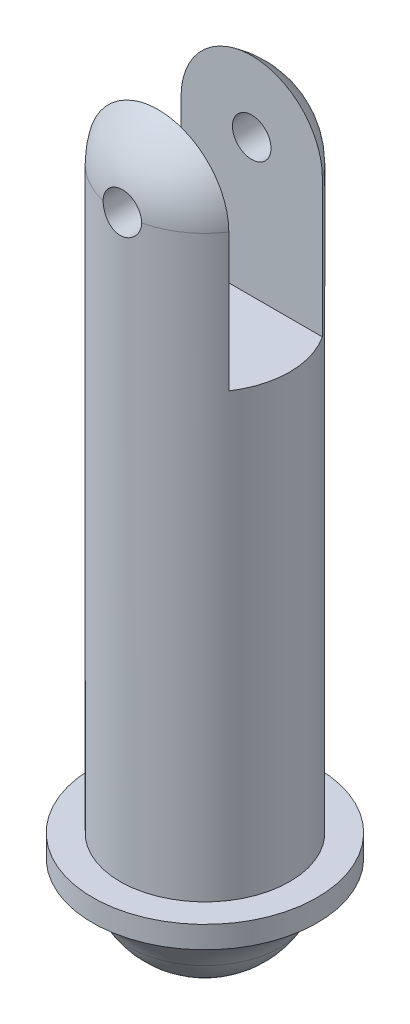
ISO-10303-21;
HEADER;
FILE_DESCRIPTION(('STEP AP214'),'2;1');
FILE_NAME('part.step','',(''),(''),'','','');
FILE_SCHEMA(('AUTOMOTIVE_DESIGN { 1 0 10303 214 1 1 1 1 }'));
ENDSEC;
DATA;
#1=APPLICATION_CONTEXT('core data for automotive mechanical design processes');
#2=APPLICATION_PROTOCOL_DEFINITION('international standard','automotive_design',2000,#1);
#3=PRODUCT_CONTEXT('',#1,'mechanical');
#4=PRODUCT('Part','Part','',(#3));
#5=PRODUCT_RELATED_PRODUCT_CATEGORY('part','',(#4));
#6=PRODUCT_DEFINITION_FORMATION('','',#4);
#7=PRODUCT_DEFINITION_CONTEXT('part definition',#1,'design');
#8=PRODUCT_DEFINITION('design','',#6,#7);
#9=PRODUCT_DEFINITION_SHAPE('','',#8);
#10=(LENGTH_UNIT() NAMED_UNIT(*) SI_UNIT(.MILLI.,.METRE.));
#11=(NAMED_UNIT(*) PLANE_ANGLE_UNIT() SI_UNIT($,.RADIAN.));
#12=(NAMED_UNIT(*) SI_UNIT($,.STERADIAN.) SOLID_ANGLE_UNIT());
#13=UNCERTAINTY_MEASURE_WITH_UNIT(LENGTH_MEASURE(1.E-05),#10,'distance_accuracy_value','');
#14=(GEOMETRIC_REPRESENTATION_CONTEXT(3) GLOBAL_UNCERTAINTY_ASSIGNED_CONTEXT((#13)) GLOBAL_UNIT_ASSIGNED_CONTEXT((#10,
#11,#12)) REPRESENTATION_CONTEXT('',''));
#15=CARTESIAN_POINT('',(0.,0.,0.));
#16=DIRECTION('',(0.,0.,1.));
#17=DIRECTION('',(1.,0.,0.));
#18=AXIS2_PLACEMENT_3D('',#15,#16,#17);
#19=CARTESIAN_POINT('',(0.,0.,0.));
#20=DIRECTION('',(0.,-1.,0.));
#21=DIRECTION('',(1.,0.,0.));
#22=AXIS2_PLACEMENT_3D('',#19,#20,#21);
#23=CYLINDRICAL_SURFACE('',#22,1.9558);
#24=CARTESIAN_POINT('',(0.,0.,0.));
#25=DIRECTION('',(0.,-1.,0.));
#26=DIRECTION('',(1.,0.,0.));
#27=AXIS2_PLACEMENT_3D('',#24,#25,#26);
#28=CIRCLE('',#27,1.9558);
#29=CARTESIAN_POINT('',(1.63089956465749,0.,1.0795));
#30=VERTEX_POINT('',#29);
#31=CARTESIAN_POINT('',(0.4445,0.,1.90461896189238));
#32=VERTEX_POINT('',#31);
#33=EDGE_CURVE('E94',#30,#32,#28,.T.);
#34=ORIENTED_EDGE('',*,*,#33,.T.);
#35=CARTESIAN_POINT('',(0.4445,0.,1.90461896189238));
#36=CARTESIAN_POINT('',(0.44452273001284,-0.0246635968022245,1.90460001005423));
#37=CARTESIAN_POINT('',(0.442448800622915,-0.0493134063288643,1.90509753542933));
#38=CARTESIAN_POINT('',(0.434284365112343,-0.0978598865842544,1.90698240428573));
#39=CARTESIAN_POINT('',(0.42820112347571,-0.121757837707106,1.90836813829481));
#40=CARTESIAN_POINT('',(0.412193611376415,-0.168169204235372,1.91188725232877));
#41=CARTESIAN_POINT('',(0.402269321359488,-0.190682612591588,1.91402063615983));
#42=CARTESIAN_POINT('',(0.378879685436702,-0.233731370625052,1.91878783812066));
#43=CARTESIAN_POINT('',(0.365413669515942,-0.254266345021712,1.92142175091306));
#44=CARTESIAN_POINT('',(0.33506218365826,-0.293140943529835,1.92694779611436));
#45=CARTESIAN_POINT('',(0.318124709604863,-0.311439476578559,1.92984342871888));
#46=CARTESIAN_POINT('',(0.281422139972595,-0.344963277211342,1.93553600091458));
#47=CARTESIAN_POINT('',(0.261656600772462,-0.360188061730215,1.93833292493596));
#48=CARTESIAN_POINT('',(0.219580718133937,-0.387295530073583,1.94355131390343));
#49=CARTESIAN_POINT('',(0.197243959734308,-0.399138183030924,1.94596814080593));
#50=CARTESIAN_POINT('',(0.150834283476316,-0.418885372056951,1.95011400631086));
#51=CARTESIAN_POINT('',(0.126761666981976,-0.426790589832237,1.95184316396223));
#52=CARTESIAN_POINT('',(0.0779932409427805,-0.438308600582936,1.95439417745114));
#53=CARTESIAN_POINT('',(0.0533147789880289,-0.441991510205409,1.95523083749664));
#54=CARTESIAN_POINT('',(0.00367648660715528,-0.445179834956215,1.95595396454403));
#55=CARTESIAN_POINT('',(-0.0212833153022637,-0.444685669738405,1.95584052699841));
#56=CARTESIAN_POINT('',(-0.0702904622039241,-0.439585468587378,1.95468744165034));
#57=CARTESIAN_POINT('',(-0.0943461461723642,-0.435055134472248,1.95366484660914));
#58=CARTESIAN_POINT('',(-0.141346393355104,-0.422132141926034,1.95082789725655));
#59=CARTESIAN_POINT('',(-0.164290912841336,-0.413739331629783,1.94901351181361));
#60=CARTESIAN_POINT('',(-0.208625393672722,-0.393264054755667,1.94476974181478));
#61=CARTESIAN_POINT('',(-0.230001823601263,-0.381153301022523,1.94233566761055));
#62=CARTESIAN_POINT('',(-0.270445708646846,-0.353607386211707,1.93711878216214));
#63=CARTESIAN_POINT('',(-0.289512889181942,-0.338171830402625,1.93433592952628));
#64=CARTESIAN_POINT('',(-0.325246204687189,-0.304006145887558,1.92865332755163));
#65=CARTESIAN_POINT('',(-0.341849208181335,-0.285210139029779,1.92575235553995));
#66=CARTESIAN_POINT('',(-0.371684010430429,-0.245064644347421,1.92021760097455));
#67=CARTESIAN_POINT('',(-0.384914887550258,-0.223714460779131,1.91758389158443));
#68=CARTESIAN_POINT('',(-0.407661789140926,-0.178955657272013,1.91287780095361));
#69=CARTESIAN_POINT('',(-0.417162924718296,-0.155539235276379,1.9108076793914));
#70=CARTESIAN_POINT('',(-0.4320631439304,-0.10739818988529,1.90749425404484));
#71=CARTESIAN_POINT('',(-0.437468339165815,-0.0826755746779893,1.90624971874064));
#72=CARTESIAN_POINT('',(-0.441993413307874,-0.0481221100137197,1.90520248188666));
#73=CARTESIAN_POINT('',(-0.442933630257451,-0.0385148214803054,1.90498395072954));
#74=CARTESIAN_POINT('',(-0.444186174887239,-0.0192731734323209,1.90469228402986));
#75=CARTESIAN_POINT('',(-0.444499539564846,-0.00963888507402481,1.90461890835981));
#76=CARTESIAN_POINT('',(-0.444500000000006,0.,1.90461896189246));
#77=B_SPLINE_CURVE_WITH_KNOTS('',3,(#35,#36,#37,#38,#39,#40,#41,#42,#43,#44,#45,#46,#47,#48,#49,
#50,#51,#52,#53,#54,#55,#56,#57,#58,#59,#60,#61,#62,#63,#64,#65,#66,#67,#68,#69,#70,#71,#72,#73,
#74,#75,#76),.UNSPECIFIED.,.F.,.F.,(4,2,2,2,2,2,2,2,2,2,2,2,2,2,2,2,2,2,2,2,4),(0.,
0.073877677664881,0.147621862809744,0.221366423381347,0.29512494481257,0.370081890302293,
0.445050606746095,0.520872997321321,0.596682255843713,0.671213492685012,0.745737241762632,
0.818891989685503,0.892049614158744,0.965778247488477,1.03951563895285,1.11489978317361,
1.19030450857748,1.26600725619818,1.34159682322518,1.37054688810836,1.39944902136113),.UNSPECIFIED.);
#78=CARTESIAN_POINT('',(-0.4445,0.,1.90461896189238));
#79=VERTEX_POINT('',#78);
#80=EDGE_CURVE('E56',#32,#79,#77,.T.);
#81=ORIENTED_EDGE('',*,*,#80,.T.);
#82=CARTESIAN_POINT('',(-1.63089956465749,0.,1.0795));
#83=VERTEX_POINT('',#82);
#84=EDGE_CURVE('E90',#79,#83,#28,.T.);
#85=ORIENTED_EDGE('',*,*,#84,.T.);
#86=DIRECTION('',(0.,-1.,0.));
#87=VECTOR('',#86,1.);
#88=CARTESIAN_POINT('',(-1.63089956465749,0.,1.0795));
#89=LINE('',#88,#87);
#90=CARTESIAN_POINT('',(-1.63089956465749,-3.175,1.0795));
#91=VERTEX_POINT('',#90);
#92=EDGE_CURVE('E121',#83,#91,#89,.T.);
#93=ORIENTED_EDGE('',*,*,#92,.T.);
#94=CARTESIAN_POINT('',(0.,-3.175,0.));
#95=DIRECTION('',(0.,1.,0.));
#96=DIRECTION('',(0.,0.,1.));
#97=AXIS2_PLACEMENT_3D('',#94,#95,#96);
#98=CIRCLE('',#97,1.9558);
#99=CARTESIAN_POINT('',(-1.63089956465749,-3.175,-1.0795));
#100=VERTEX_POINT('',#99);
#101=EDGE_CURVE('E172',#100,#91,#98,.T.);
#102=ORIENTED_EDGE('',*,*,#101,.F.);
#103=DIRECTION('',(0.,-1.,0.));
#104=VECTOR('',#103,1.);
#105=CARTESIAN_POINT('',(-1.63089956465749,0.,-1.0795));
#106=LINE('',#105,#104);
#107=CARTESIAN_POINT('',(-1.63089956465749,0.,-1.0795));
#108=VERTEX_POINT('',#107);
#109=EDGE_CURVE('E111',#108,#100,#106,.T.);
#110=ORIENTED_EDGE('',*,*,#109,.F.);
#111=CARTESIAN_POINT('',(-0.4445,0.,-1.90461896189238));
#112=VERTEX_POINT('',#111);
#113=EDGE_CURVE('E105',#108,#112,#28,.T.);
#114=ORIENTED_EDGE('',*,*,#113,.T.);
#115=CARTESIAN_POINT('',(-0.4445,0.,-1.90461896189238));
#116=CARTESIAN_POINT('',(-0.444522730012841,-0.0246635968022246,-1.90460001005423));
#117=CARTESIAN_POINT('',(-0.442448800622915,-0.0493134063288643,-1.90509753542933));
#118=CARTESIAN_POINT('',(-0.434284365112343,-0.0978598865842546,-1.90698240428573));
#119=CARTESIAN_POINT('',(-0.42820112347571,-0.121757837707106,-1.90836813829481));
#120=CARTESIAN_POINT('',(-0.412193611376415,-0.168169204235372,-1.91188725232877));
#121=CARTESIAN_POINT('',(-0.402269321359488,-0.190682612591588,-1.91402063615983));
#122=CARTESIAN_POINT('',(-0.378879685436702,-0.233731370625053,-1.91878783812066));
#123=CARTESIAN_POINT('',(-0.365413669515942,-0.254266345021713,-1.92142175091306));
#124=CARTESIAN_POINT('',(-0.33506218365826,-0.293140943529835,-1.92694779611436));
#125=CARTESIAN_POINT('',(-0.318124709604863,-0.311439476578559,-1.92984342871888));
#126=CARTESIAN_POINT('',(-0.281422139972595,-0.344963277211342,-1.93553600091458));
#127=CARTESIAN_POINT('',(-0.261656600772462,-0.360188061730215,-1.93833292493596));
#128=CARTESIAN_POINT('',(-0.219580718133937,-0.387295530073583,-1.94355131390343));
#129=CARTESIAN_POINT('',(-0.197243959734308,-0.399138183030924,-1.94596814080593));
#130=CARTESIAN_POINT('',(-0.150834283476316,-0.418885372056951,-1.95011400631086));
#131=CARTESIAN_POINT('',(-0.126761666981976,-0.426790589832237,-1.95184316396223));
#132=CARTESIAN_POINT('',(-0.0779932409427803,-0.438308600582936,-1.95439417745114));
#133=CARTESIAN_POINT('',(-0.0533147789880287,-0.441991510205409,-1.95523083749664));
#134=CARTESIAN_POINT('',(-0.00367648660715501,-0.445179834956215,-1.95595396454403));
#135=CARTESIAN_POINT('',(0.021283315302264,-0.444685669738405,-1.95584052699841));
#136=CARTESIAN_POINT('',(0.0702904622039244,-0.439585468587378,-1.95468744165034));
#137=CARTESIAN_POINT('',(0.0943461461723645,-0.435055134472248,-1.95366484660914));
#138=CARTESIAN_POINT('',(0.141346393355104,-0.422132141926034,-1.95082789725655));
#139=CARTESIAN_POINT('',(0.164290912841337,-0.413739331629783,-1.94901351181361));
#140=CARTESIAN_POINT('',(0.208625393672723,-0.393264054755667,-1.94476974181478));
#141=CARTESIAN_POINT('',(0.230001823601264,-0.381153301022522,-1.94233566761055));
#142=CARTESIAN_POINT('',(0.270445708646847,-0.353607386211707,-1.93711878216214));
#143=CARTESIAN_POINT('',(0.289512889181942,-0.338171830402625,-1.93433592952628));
#144=CARTESIAN_POINT('',(0.325246204687189,-0.304006145887558,-1.92865332755163));
#145=CARTESIAN_POINT('',(0.341849208181336,-0.285210139029779,-1.92575235553995));
#146=CARTESIAN_POINT('',(0.371684010430429,-0.24506464434742,-1.92021760097455));
#147=CARTESIAN_POINT('',(0.384914887550258,-0.223714460779131,-1.91758389158443));
#148=CARTESIAN_POINT('',(0.407661789140926,-0.178955657272013,-1.91287780095361));
#149=CARTESIAN_POINT('',(0.417162924718296,-0.155539235276379,-1.9108076793914));
#150=CARTESIAN_POINT('',(0.4320631439304,-0.10739818988529,-1.90749425404484));
#151=CARTESIAN_POINT('',(0.437468339165815,-0.0826755746779891,-1.90624971874064));
#152=CARTESIAN_POINT('',(0.441993413307874,-0.0481221100137195,-1.90520248188666));
#153=CARTESIAN_POINT('',(0.442933630257451,-0.0385148214803052,-1.90498395072954));
#154=CARTESIAN_POINT('',(0.444186174887239,-0.0192731734323209,-1.90469228402986));
#155=CARTESIAN_POINT('',(0.444499539564846,-0.00963888507402473,-1.90461890835981));
#156=CARTESIAN_POINT('',(0.444500000000006,0.,-1.90461896189246));
#157=B_SPLINE_CURVE_WITH_KNOTS('',3,(#115,#116,#117,#118,#119,#120,#121,#122,#123,#124,#125,
#126,#127,#128,#129,#130,#131,#132,#133,#134,#135,#136,#137,#138,#139,#140,#141,#142,#143,#144,
#145,#146,#147,#148,#149,#150,#151,#152,#153,#154,#155,#156),.UNSPECIFIED.,.F.,.F.,(4,2,2,2,2,2,
2,2,2,2,2,2,2,2,2,2,2,2,2,2,4),(0.,0.0738776776648811,0.147621862809744,0.221366423381347,
0.295124944812571,0.370081890302293,0.445050606746095,0.520872997321321,0.596682255843713,
0.671213492685012,0.745737241762633,0.818891989685504,0.892049614158745,0.965778247488477,
1.03951563895285,1.11489978317361,1.19030450857748,1.26600725619818,1.34159682322518,
1.37054688810836,1.39944902136113),.UNSPECIFIED.);
#158=CARTESIAN_POINT('',(0.4445,0.,-1.90461896189238));
#159=VERTEX_POINT('',#158);
#160=EDGE_CURVE('E49',#112,#159,#157,.T.);
#161=ORIENTED_EDGE('',*,*,#160,.T.);
#162=CARTESIAN_POINT('',(1.63089956465749,0.,-1.0795));
#163=VERTEX_POINT('',#162);
#164=EDGE_CURVE('E107',#159,#163,#28,.T.);
#165=ORIENTED_EDGE('',*,*,#164,.T.);
#166=DIRECTION('',(0.,-1.,0.));
#167=VECTOR('',#166,1.);
#168=CARTESIAN_POINT('',(1.63089956465749,0.,-1.0795));
#169=LINE('',#168,#167);
#170=CARTESIAN_POINT('',(1.63089956465749,-3.175,-1.0795));
#171=VERTEX_POINT('',#170);
#172=EDGE_CURVE('E116',#171,#163,#169,.F.);
#173=ORIENTED_EDGE('',*,*,#172,.F.);
#174=CARTESIAN_POINT('',(1.63089956465749,-3.175,1.0795));
#175=VERTEX_POINT('',#174);
#176=EDGE_CURVE('E169',#175,#171,#98,.T.);
#177=ORIENTED_EDGE('',*,*,#176,.F.);
#178=DIRECTION('',(0.,-1.,0.));
#179=VECTOR('',#178,1.);
#180=CARTESIAN_POINT('',(1.63089956465749,0.,1.0795));
#181=LINE('',#180,#179);
#182=EDGE_CURVE('E125',#175,#30,#181,.F.);
#183=ORIENTED_EDGE('',*,*,#182,.T.);
#184=EDGE_LOOP('',(#34,#81,#85,#93,#102,#110,#114,#161,#165,#173,#177,#183));
#185=FACE_BOUND('',#184,.T.);
#186=CARTESIAN_POINT('',(0.,-13.3604,0.));
#187=DIRECTION('',(0.,-1.,0.));
#188=DIRECTION('',(0.,0.,-1.));
#189=AXIS2_PLACEMENT_3D('',#186,#187,#188);
#190=CIRCLE('',#189,1.9558);
#191=CARTESIAN_POINT('',(0.,-13.3604,-1.9558));
#192=VERTEX_POINT('',#191);
#193=EDGE_CURVE('E43',#192,#192,#190,.T.);
#194=ORIENTED_EDGE('',*,*,#193,.F.);
#195=EDGE_LOOP('',(#194));
#196=FACE_BOUND('',#195,.T.);
#197=ADVANCED_FACE('F35',(#185,#196),#23,.T.);
#198=CARTESIAN_POINT('',(0.,0.,0.));
#199=DIRECTION('',(0.,-1.,0.));
#200=DIRECTION('',(1.,0.,0.));
#201=AXIS2_PLACEMENT_3D('',#198,#199,#200);
#202=SPHERICAL_SURFACE('',#201,1.9558);
#203=ORIENTED_EDGE('',*,*,#164,.F.);
#204=CARTESIAN_POINT('',(0.,0.,-1.90461896189238));
#205=DIRECTION('',(0.,0.,1.));
#206=DIRECTION('',(1.,0.,0.));
#207=AXIS2_PLACEMENT_3D('',#204,#205,#206);
#208=CIRCLE('',#207,0.4445);
#209=EDGE_CURVE('E95',#159,#112,#208,.T.);
#210=ORIENTED_EDGE('',*,*,#209,.T.);
#211=ORIENTED_EDGE('',*,*,#113,.F.);
#212=CARTESIAN_POINT('',(0.,0.,-1.0795));
#213=DIRECTION('',(0.,0.,1.));
#214=DIRECTION('',(0.,-1.,0.));
#215=AXIS2_PLACEMENT_3D('',#212,#213,#214);
#216=CIRCLE('',#215,1.63089956465749);
#217=EDGE_CURVE('E177',#163,#108,#216,.T.);
#218=ORIENTED_EDGE('',*,*,#217,.F.);
#219=EDGE_LOOP('',(#203,#210,#211,#218));
#220=FACE_BOUND('',#219,.T.);
#221=ADVANCED_FACE('F182',(#220),#202,.T.);
#222=ORIENTED_EDGE('',*,*,#84,.F.);
#223=CARTESIAN_POINT('',(0.,0.,1.90461896189238));
#224=DIRECTION('',(0.,0.,-1.));
#225=DIRECTION('',(-1.,0.,0.));
#226=AXIS2_PLACEMENT_3D('',#223,#224,#225);
#227=CIRCLE('',#226,0.4445);
#228=EDGE_CURVE('E96',#79,#32,#227,.T.);
#229=ORIENTED_EDGE('',*,*,#228,.T.);
#230=ORIENTED_EDGE('',*,*,#33,.F.);
#231=CARTESIAN_POINT('',(0.,0.,1.0795));
#232=DIRECTION('',(0.,0.,1.));
#233=DIRECTION('',(0.,-1.,0.));
#234=AXIS2_PLACEMENT_3D('',#231,#232,#233);
#235=CIRCLE('',#234,1.63089956465749);
#236=EDGE_CURVE('E104',#30,#83,#235,.T.);
#237=ORIENTED_EDGE('',*,*,#236,.T.);
#238=EDGE_LOOP('',(#222,#229,#230,#237));
#239=FACE_BOUND('',#238,.T.);
#240=ADVANCED_FACE('F103',(#239),#202,.T.);
#241=CARTESIAN_POINT('',(-1.9558,-3.175,-1.0795));
#242=DIRECTION('',(0.,1.,0.));
#243=DIRECTION('',(0.,0.,1.));
#244=AXIS2_PLACEMENT_3D('',#241,#242,#243);
#245=PLANE('',#244);
#246=DIRECTION('',(1.,0.,0.));
#247=VECTOR('',#246,1.);
#248=CARTESIAN_POINT('',(-1.9558,-3.175,1.0795));
#249=LINE('',#248,#247);
#250=EDGE_CURVE('E129',#91,#175,#249,.T.);
#251=ORIENTED_EDGE('',*,*,#250,.T.);
#252=ORIENTED_EDGE('',*,*,#176,.T.);
#253=DIRECTION('',(1.,0.,0.));
#254=VECTOR('',#253,1.);
#255=CARTESIAN_POINT('',(-1.9558,-3.175,-1.0795));
#256=LINE('',#255,#254);
#257=EDGE_CURVE('E127',#100,#171,#256,.T.);
#258=ORIENTED_EDGE('',*,*,#257,.F.);
#259=ORIENTED_EDGE('',*,*,#101,.T.);
#260=EDGE_LOOP('',(#251,#252,#258,#259));
#261=FACE_BOUND('',#260,.T.);
#262=ADVANCED_FACE('F189',(#261),#245,.T.);
#263=CARTESIAN_POINT('',(-1.9558,2.13936720514233,-1.0795));
#264=DIRECTION('',(0.,0.,1.));
#265=DIRECTION('',(0.,-1.,0.));
#266=AXIS2_PLACEMENT_3D('',#263,#264,#265);
#267=PLANE('',#266);
#268=CARTESIAN_POINT('',(0.,0.,-1.0795));
#269=DIRECTION('',(0.,0.,1.));
#270=DIRECTION('',(0.,-1.,0.));
#271=AXIS2_PLACEMENT_3D('',#268,#269,#270);
#272=CIRCLE('',#271,0.4445);
#273=CARTESIAN_POINT('',(0.,-0.4445,-1.0795));
#274=VERTEX_POINT('',#273);
#275=EDGE_CURVE('E100',#274,#274,#272,.T.);
#276=ORIENTED_EDGE('',*,*,#275,.F.);
#277=EDGE_LOOP('',(#276));
#278=FACE_BOUND('',#277,.T.);
#279=ORIENTED_EDGE('',*,*,#109,.T.);
#280=ORIENTED_EDGE('',*,*,#257,.T.);
#281=ORIENTED_EDGE('',*,*,#172,.T.);
#282=ORIENTED_EDGE('',*,*,#217,.T.);
#283=EDGE_LOOP('',(#279,#280,#281,#282));
#284=FACE_BOUND('',#283,.T.);
#285=ADVANCED_FACE('F179',(#278,#284),#267,.T.);
#286=CARTESIAN_POINT('',(-1.9558,2.13936720514233,1.0795));
#287=DIRECTION('',(0.,0.,1.));
#288=DIRECTION('',(0.,-1.,0.));
#289=AXIS2_PLACEMENT_3D('',#286,#287,#288);
#290=PLANE('',#289);
#291=CARTESIAN_POINT('',(0.,0.,1.0795));
#292=DIRECTION('',(0.,0.,1.));
#293=DIRECTION('',(0.,-1.,0.));
#294=AXIS2_PLACEMENT_3D('',#291,#292,#293);
#295=CIRCLE('',#294,0.4445);
#296=CARTESIAN_POINT('',(0.,-0.4445,1.0795));
#297=VERTEX_POINT('',#296);
#298=EDGE_CURVE('E156',#297,#297,#295,.T.);
#299=ORIENTED_EDGE('',*,*,#298,.T.);
#300=EDGE_LOOP('',(#299));
#301=FACE_BOUND('',#300,.T.);
#302=ORIENTED_EDGE('',*,*,#236,.F.);
#303=ORIENTED_EDGE('',*,*,#182,.F.);
#304=ORIENTED_EDGE('',*,*,#250,.F.);
#305=ORIENTED_EDGE('',*,*,#92,.F.);
#306=EDGE_LOOP('',(#302,#303,#304,#305));
#307=FACE_BOUND('',#306,.T.);
#308=ADVANCED_FACE('F147',(#301,#307),#290,.F.);
#309=CARTESIAN_POINT('',(0.,0.,-1.9558));
#310=DIRECTION('',(0.,0.,1.));
#311=DIRECTION('',(1.,0.,0.));
#312=AXIS2_PLACEMENT_3D('',#309,#310,#311);
#313=CYLINDRICAL_SURFACE('',#312,0.4445);
#314=ORIENTED_EDGE('',*,*,#298,.F.);
#315=EDGE_LOOP('',(#314));
#316=FACE_BOUND('',#315,.T.);
#317=ORIENTED_EDGE('',*,*,#228,.F.);
#318=ORIENTED_EDGE('',*,*,#80,.F.);
#319=EDGE_LOOP('',(#317,#318));
#320=FACE_BOUND('',#319,.T.);
#321=ADVANCED_FACE('F98',(#316,#320),#313,.F.);
#322=ORIENTED_EDGE('',*,*,#275,.T.);
#323=EDGE_LOOP('',(#322));
#324=FACE_BOUND('',#323,.T.);
#325=ORIENTED_EDGE('',*,*,#209,.F.);
#326=ORIENTED_EDGE('',*,*,#160,.F.);
#327=EDGE_LOOP('',(#325,#326));
#328=FACE_BOUND('',#327,.T.);
#329=ADVANCED_FACE('F139',(#324,#328),#313,.F.);
#330=CARTESIAN_POINT('',(0.,-13.3604,0.));
#331=DIRECTION('',(0.,-1.,0.));
#332=DIRECTION('',(0.,0.,-1.));
#333=AXIS2_PLACEMENT_3D('',#330,#331,#332);
#334=CYLINDRICAL_SURFACE('',#333,2.5908);
#335=CARTESIAN_POINT('',(0.,-13.3604,0.));
#336=DIRECTION('',(0.,-1.,0.));
#337=DIRECTION('',(0.,0.,-1.));
#338=AXIS2_PLACEMENT_3D('',#335,#336,#337);
#339=CIRCLE('',#338,2.5908);
#340=CARTESIAN_POINT('',(0.,-13.3604,-2.5908));
#341=VERTEX_POINT('',#340);
#342=EDGE_CURVE('E160',#341,#341,#339,.T.);
#343=ORIENTED_EDGE('',*,*,#342,.T.);
#344=EDGE_LOOP('',(#343));
#345=FACE_BOUND('',#344,.T.);
#346=CARTESIAN_POINT('',(0.,-13.8684,0.));
#347=DIRECTION('',(0.,-1.,0.));
#348=DIRECTION('',(0.,0.,-1.));
#349=AXIS2_PLACEMENT_3D('',#346,#347,#348);
#350=CIRCLE('',#349,2.5908);
#351=CARTESIAN_POINT('',(0.,-13.8684,-2.5908));
#352=VERTEX_POINT('',#351);
#353=EDGE_CURVE('E157',#352,#352,#350,.T.);
#354=ORIENTED_EDGE('',*,*,#353,.F.);
#355=EDGE_LOOP('',(#354));
#356=FACE_BOUND('',#355,.T.);
#357=ADVANCED_FACE('F144',(#345,#356),#334,.T.);
#358=CARTESIAN_POINT('',(0.,-13.3604,0.));
#359=DIRECTION('',(0.,-1.,0.));
#360=DIRECTION('',(0.,0.,-1.));
#361=AXIS2_PLACEMENT_3D('',#358,#359,#360);
#362=PLANE('',#361);
#363=ORIENTED_EDGE('',*,*,#193,.T.);
#364=EDGE_LOOP('',(#363));
#365=FACE_BOUND('',#364,.T.);
#366=ORIENTED_EDGE('',*,*,#342,.F.);
#367=EDGE_LOOP('',(#366));
#368=FACE_BOUND('',#367,.T.);
#369=ADVANCED_FACE('F193',(#365,#368),#362,.F.);
#370=CARTESIAN_POINT('',(0.,-13.8684,0.));
#371=DIRECTION('',(0.,-1.,0.));
#372=DIRECTION('',(-1.,0.,0.));
#373=AXIS2_PLACEMENT_3D('',#370,#371,#372);
#374=SPHERICAL_SURFACE('',#373,1.9558);
#375=CARTESIAN_POINT('',(0.,-14.8015600917811,0.));
#376=DIRECTION('',(0.,1.,0.));
#377=DIRECTION('',(0.,0.,1.));
#378=AXIS2_PLACEMENT_3D('',#375,#376,#377);
#379=CIRCLE('',#378,1.71882689154758);
#380=CARTESIAN_POINT('',(0.,-14.8015600917811,1.71882689154758));
#381=VERTEX_POINT('',#380);
#382=EDGE_CURVE('E11',#381,#381,#379,.F.);
#383=ORIENTED_EDGE('',*,*,#382,.T.);
#384=EDGE_LOOP('',(#383));
#385=FACE_BOUND('',#384,.T.);
#386=ADVANCED_FACE('F191',(#385),#374,.T.);
#387=CARTESIAN_POINT('',(0.,-16.0134563148734,0.));
#388=DIRECTION('',(0.,-1.,0.));
#389=DIRECTION('',(0.,0.,-1.));
#390=AXIS2_PLACEMENT_3D('',#387,#388,#389);
#391=TOROIDAL_SURFACE('',#390,3.95106960784314,2.54);
#392=ORIENTED_EDGE('',*,*,#353,.T.);
#393=EDGE_LOOP('',(#392));
#394=FACE_BOUND('',#393,.T.);
#395=ORIENTED_EDGE('',*,*,#382,.F.);
#396=EDGE_LOOP('',(#395));
#397=FACE_BOUND('',#396,.T.);
#398=ADVANCED_FACE('F37',(#394,#397),#391,.F.);
#399=CLOSED_SHELL('',(#197,#221,#240,#262,#285,#308,#321,#329,#357,#369,#386,#398));
#400=MANIFOLD_SOLID_BREP('B2',#399);
#401=ADVANCED_BREP_SHAPE_REPRESENTATION('',(#18,#400),#14);
#402=SHAPE_DEFINITION_REPRESENTATION(#9,#401);
ENDSEC;
END-ISO-10303-21;
